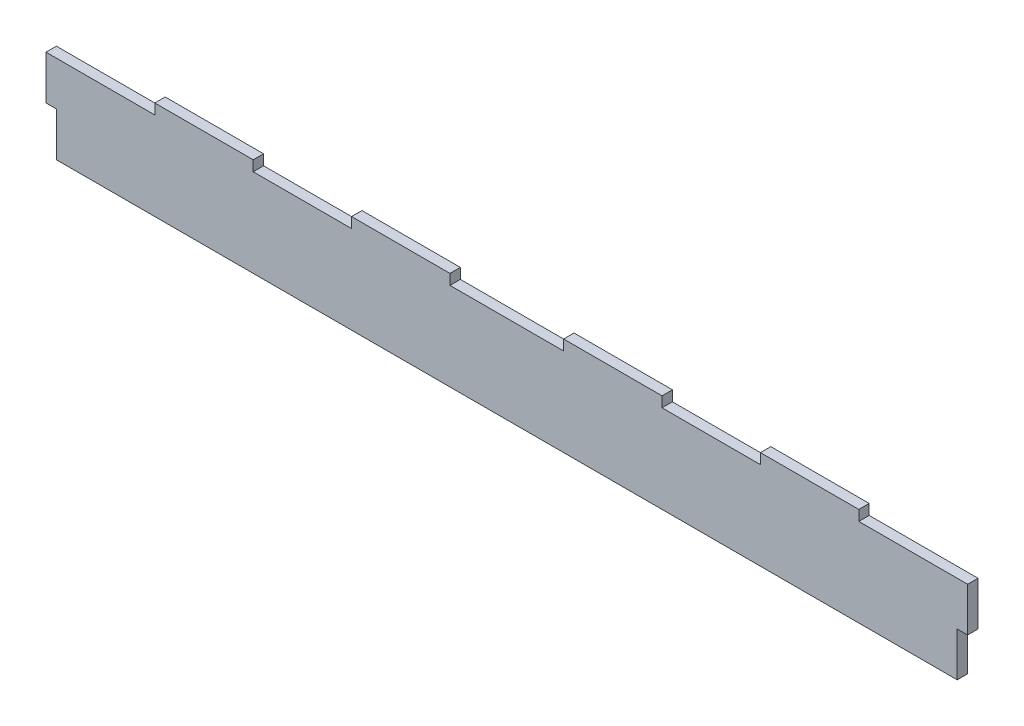
ISO-10303-21;
HEADER;
FILE_DESCRIPTION(('STEP AP214'),'2;1');
FILE_NAME('part.step','',(''),(''),'','','');
FILE_SCHEMA(('AUTOMOTIVE_DESIGN { 1 0 10303 214 1 1 1 1 }'));
ENDSEC;
DATA;
#1=APPLICATION_CONTEXT('core data for automotive mechanical design processes');
#2=APPLICATION_PROTOCOL_DEFINITION('international standard','automotive_design',2000,#1);
#3=PRODUCT_CONTEXT('',#1,'mechanical');
#4=PRODUCT('Part','Part','',(#3));
#5=PRODUCT_RELATED_PRODUCT_CATEGORY('part','',(#4));
#6=PRODUCT_DEFINITION_FORMATION('','',#4);
#7=PRODUCT_DEFINITION_CONTEXT('part definition',#1,'design');
#8=PRODUCT_DEFINITION('design','',#6,#7);
#9=PRODUCT_DEFINITION_SHAPE('','',#8);
#10=(LENGTH_UNIT() NAMED_UNIT(*) SI_UNIT(.MILLI.,.METRE.));
#11=(NAMED_UNIT(*) PLANE_ANGLE_UNIT() SI_UNIT($,.RADIAN.));
#12=(NAMED_UNIT(*) SI_UNIT($,.STERADIAN.) SOLID_ANGLE_UNIT());
#13=UNCERTAINTY_MEASURE_WITH_UNIT(LENGTH_MEASURE(1.E-05),#10,'distance_accuracy_value','');
#14=(GEOMETRIC_REPRESENTATION_CONTEXT(3) GLOBAL_UNCERTAINTY_ASSIGNED_CONTEXT((#13)) GLOBAL_UNIT_ASSIGNED_CONTEXT((#10,
#11,#12)) REPRESENTATION_CONTEXT('',''));
#15=CARTESIAN_POINT('',(0.,0.,0.));
#16=DIRECTION('',(0.,0.,1.));
#17=DIRECTION('',(1.,0.,0.));
#18=AXIS2_PLACEMENT_3D('',#15,#16,#17);
#19=CARTESIAN_POINT('',(3.00000000000001,12.7,3.));
#20=DIRECTION('',(1.,0.,0.));
#21=DIRECTION('',(0.,1.,0.));
#22=AXIS2_PLACEMENT_3D('',#19,#20,#21);
#23=PLANE('',#22);
#24=DIRECTION('',(0.,-1.,0.));
#25=VECTOR('',#24,1.);
#26=CARTESIAN_POINT('',(3.00000000000001,12.7,0.));
#27=LINE('',#26,#25);
#28=CARTESIAN_POINT('',(3.00000000000001,12.7,0.));
#29=VERTEX_POINT('',#28);
#30=CARTESIAN_POINT('',(3.00000000000002,0.,0.));
#31=VERTEX_POINT('',#30);
#32=EDGE_CURVE('E224',#29,#31,#27,.T.);
#33=ORIENTED_EDGE('',*,*,#32,.T.);
#34=DIRECTION('',(0.,0.,-1.));
#35=VECTOR('',#34,1.);
#36=CARTESIAN_POINT('',(3.00000000000002,0.,3.));
#37=LINE('',#36,#35);
#38=CARTESIAN_POINT('',(3.00000000000002,0.,3.));
#39=VERTEX_POINT('',#38);
#40=EDGE_CURVE('E11',#39,#31,#37,.T.);
#41=ORIENTED_EDGE('',*,*,#40,.F.);
#42=DIRECTION('',(0.,-1.,0.));
#43=VECTOR('',#42,1.);
#44=CARTESIAN_POINT('',(3.00000000000001,12.7,3.));
#45=LINE('',#44,#43);
#46=CARTESIAN_POINT('',(3.00000000000001,12.7,3.));
#47=VERTEX_POINT('',#46);
#48=EDGE_CURVE('E272',#47,#39,#45,.T.);
#49=ORIENTED_EDGE('',*,*,#48,.F.);
#50=DIRECTION('',(0.,0.,-1.));
#51=VECTOR('',#50,1.);
#52=CARTESIAN_POINT('',(3.00000000000001,12.7,3.));
#53=LINE('',#52,#51);
#54=EDGE_CURVE('E220',#47,#29,#53,.T.);
#55=ORIENTED_EDGE('',*,*,#54,.T.);
#56=EDGE_LOOP('',(#33,#41,#49,#55));
#57=FACE_BOUND('',#56,.T.);
#58=ADVANCED_FACE('F33',(#57),#23,.F.);
#59=CARTESIAN_POINT('',(3.00000000000002,0.,3.));
#60=DIRECTION('',(0.,1.,0.));
#61=DIRECTION('',(0.,0.,1.));
#62=AXIS2_PLACEMENT_3D('',#59,#60,#61);
#63=PLANE('',#62);
#64=DIRECTION('',(1.,0.,0.));
#65=VECTOR('',#64,1.);
#66=CARTESIAN_POINT('',(3.00000000000002,0.,0.));
#67=LINE('',#66,#65);
#68=CARTESIAN_POINT('',(263.,0.,0.));
#69=VERTEX_POINT('',#68);
#70=EDGE_CURVE('E227',#31,#69,#67,.T.);
#71=ORIENTED_EDGE('',*,*,#70,.T.);
#72=DIRECTION('',(0.,0.,-1.));
#73=VECTOR('',#72,1.);
#74=CARTESIAN_POINT('',(263.,0.,3.));
#75=LINE('',#74,#73);
#76=CARTESIAN_POINT('',(263.,0.,3.));
#77=VERTEX_POINT('',#76);
#78=EDGE_CURVE('E41',#77,#69,#75,.T.);
#79=ORIENTED_EDGE('',*,*,#78,.F.);
#80=DIRECTION('',(1.,0.,0.));
#81=VECTOR('',#80,1.);
#82=CARTESIAN_POINT('',(3.00000000000002,0.,3.));
#83=LINE('',#82,#81);
#84=EDGE_CURVE('E140',#39,#77,#83,.T.);
#85=ORIENTED_EDGE('',*,*,#84,.F.);
#86=ORIENTED_EDGE('',*,*,#40,.T.);
#87=EDGE_LOOP('',(#71,#79,#85,#86));
#88=FACE_BOUND('',#87,.T.);
#89=ADVANCED_FACE('F410',(#88),#63,.F.);
#90=CARTESIAN_POINT('',(263.,12.7,3.));
#91=DIRECTION('',(-1.,0.,0.));
#92=DIRECTION('',(0.,0.,1.));
#93=AXIS2_PLACEMENT_3D('',#90,#91,#92);
#94=PLANE('',#93);
#95=DIRECTION('',(0.,1.,0.));
#96=VECTOR('',#95,1.);
#97=CARTESIAN_POINT('',(263.,12.7,0.));
#98=LINE('',#97,#96);
#99=CARTESIAN_POINT('',(263.,12.7,0.));
#100=VERTEX_POINT('',#99);
#101=EDGE_CURVE('E229',#69,#100,#98,.T.);
#102=ORIENTED_EDGE('',*,*,#101,.T.);
#103=DIRECTION('',(0.,0.,-1.));
#104=VECTOR('',#103,1.);
#105=CARTESIAN_POINT('',(263.,12.7,3.));
#106=LINE('',#105,#104);
#107=CARTESIAN_POINT('',(263.,12.7,3.));
#108=VERTEX_POINT('',#107);
#109=EDGE_CURVE('E327',#108,#100,#106,.T.);
#110=ORIENTED_EDGE('',*,*,#109,.F.);
#111=DIRECTION('',(0.,1.,0.));
#112=VECTOR('',#111,1.);
#113=CARTESIAN_POINT('',(263.,12.7,3.));
#114=LINE('',#113,#112);
#115=EDGE_CURVE('E335',#77,#108,#114,.T.);
#116=ORIENTED_EDGE('',*,*,#115,.F.);
#117=ORIENTED_EDGE('',*,*,#78,.T.);
#118=EDGE_LOOP('',(#102,#110,#116,#117));
#119=FACE_BOUND('',#118,.T.);
#120=ADVANCED_FACE('F333',(#119),#94,.F.);
#121=CARTESIAN_POINT('',(266.,12.7000000000002,3.));
#122=DIRECTION('',(0.,1.,0.));
#123=DIRECTION('',(-1.,0.,0.));
#124=AXIS2_PLACEMENT_3D('',#121,#122,#123);
#125=PLANE('',#124);
#126=DIRECTION('',(1.,0.,0.));
#127=VECTOR('',#126,1.);
#128=CARTESIAN_POINT('',(266.,12.7000000000002,0.));
#129=LINE('',#128,#127);
#130=CARTESIAN_POINT('',(266.,12.7000000000002,0.));
#131=VERTEX_POINT('',#130);
#132=EDGE_CURVE('E231',#100,#131,#129,.T.);
#133=ORIENTED_EDGE('',*,*,#132,.T.);
#134=DIRECTION('',(0.,0.,-1.));
#135=VECTOR('',#134,1.);
#136=CARTESIAN_POINT('',(266.,12.7000000000002,3.));
#137=LINE('',#136,#135);
#138=CARTESIAN_POINT('',(266.,12.7000000000002,3.));
#139=VERTEX_POINT('',#138);
#140=EDGE_CURVE('E324',#139,#131,#137,.T.);
#141=ORIENTED_EDGE('',*,*,#140,.F.);
#142=DIRECTION('',(1.,0.,0.));
#143=VECTOR('',#142,1.);
#144=CARTESIAN_POINT('',(266.,12.7000000000002,3.));
#145=LINE('',#144,#143);
#146=EDGE_CURVE('E352',#108,#139,#145,.T.);
#147=ORIENTED_EDGE('',*,*,#146,.F.);
#148=ORIENTED_EDGE('',*,*,#109,.T.);
#149=EDGE_LOOP('',(#133,#141,#147,#148));
#150=FACE_BOUND('',#149,.T.);
#151=ADVANCED_FACE('F343',(#150),#125,.F.);
#152=CARTESIAN_POINT('',(266.,25.4,3.));
#153=DIRECTION('',(-1.,0.,0.));
#154=DIRECTION('',(0.,0.,1.));
#155=AXIS2_PLACEMENT_3D('',#152,#153,#154);
#156=PLANE('',#155);
#157=DIRECTION('',(0.,1.,0.));
#158=VECTOR('',#157,1.);
#159=CARTESIAN_POINT('',(266.,25.4,0.));
#160=LINE('',#159,#158);
#161=CARTESIAN_POINT('',(266.,25.4,0.));
#162=VERTEX_POINT('',#161);
#163=EDGE_CURVE('E233',#131,#162,#160,.T.);
#164=ORIENTED_EDGE('',*,*,#163,.T.);
#165=DIRECTION('',(0.,0.,-1.));
#166=VECTOR('',#165,1.);
#167=CARTESIAN_POINT('',(266.,25.4,3.));
#168=LINE('',#167,#166);
#169=CARTESIAN_POINT('',(266.,25.4,3.));
#170=VERTEX_POINT('',#169);
#171=EDGE_CURVE('E321',#170,#162,#168,.T.);
#172=ORIENTED_EDGE('',*,*,#171,.F.);
#173=DIRECTION('',(0.,1.,0.));
#174=VECTOR('',#173,1.);
#175=CARTESIAN_POINT('',(266.,25.4,3.));
#176=LINE('',#175,#174);
#177=EDGE_CURVE('E349',#139,#170,#176,.T.);
#178=ORIENTED_EDGE('',*,*,#177,.F.);
#179=ORIENTED_EDGE('',*,*,#140,.T.);
#180=EDGE_LOOP('',(#164,#172,#178,#179));
#181=FACE_BOUND('',#180,.T.);
#182=ADVANCED_FACE('F347',(#181),#156,.F.);
#183=CARTESIAN_POINT('',(263.,25.4,3.));
#184=DIRECTION('',(0.,-1.,0.));
#185=DIRECTION('',(0.,0.,-1.));
#186=AXIS2_PLACEMENT_3D('',#183,#184,#185);
#187=PLANE('',#186);
#188=DIRECTION('',(-1.,0.,0.));
#189=VECTOR('',#188,1.);
#190=CARTESIAN_POINT('',(263.,25.4,0.));
#191=LINE('',#190,#189);
#192=CARTESIAN_POINT('',(234.6,25.4,0.));
#193=VERTEX_POINT('',#192);
#194=EDGE_CURVE('E236',#162,#193,#191,.T.);
#195=ORIENTED_EDGE('',*,*,#194,.T.);
#196=DIRECTION('',(0.,0.,-1.));
#197=VECTOR('',#196,1.);
#198=CARTESIAN_POINT('',(234.6,25.4,3.));
#199=LINE('',#198,#197);
#200=CARTESIAN_POINT('',(234.6,25.4,3.));
#201=VERTEX_POINT('',#200);
#202=EDGE_CURVE('E318',#201,#193,#199,.T.);
#203=ORIENTED_EDGE('',*,*,#202,.F.);
#204=DIRECTION('',(-1.,0.,0.));
#205=VECTOR('',#204,1.);
#206=CARTESIAN_POINT('',(266.,25.4,3.));
#207=LINE('',#206,#205);
#208=EDGE_CURVE('E351',#170,#201,#207,.T.);
#209=ORIENTED_EDGE('',*,*,#208,.F.);
#210=ORIENTED_EDGE('',*,*,#171,.T.);
#211=EDGE_LOOP('',(#195,#203,#209,#210));
#212=FACE_BOUND('',#211,.T.);
#213=ADVANCED_FACE('F423',(#212),#187,.F.);
#214=CARTESIAN_POINT('',(234.6,25.4,3.));
#215=DIRECTION('',(-1.,0.,0.));
#216=DIRECTION('',(0.,0.,1.));
#217=AXIS2_PLACEMENT_3D('',#214,#215,#216);
#218=PLANE('',#217);
#219=DIRECTION('',(0.,1.,0.));
#220=VECTOR('',#219,1.);
#221=CARTESIAN_POINT('',(234.6,25.4,0.));
#222=LINE('',#221,#220);
#223=CARTESIAN_POINT('',(234.6,28.4,0.));
#224=VERTEX_POINT('',#223);
#225=EDGE_CURVE('E238',#193,#224,#222,.T.);
#226=ORIENTED_EDGE('',*,*,#225,.T.);
#227=DIRECTION('',(0.,0.,-1.));
#228=VECTOR('',#227,1.);
#229=CARTESIAN_POINT('',(234.6,28.4,3.));
#230=LINE('',#229,#228);
#231=CARTESIAN_POINT('',(234.6,28.4,3.));
#232=VERTEX_POINT('',#231);
#233=EDGE_CURVE('E315',#232,#224,#230,.T.);
#234=ORIENTED_EDGE('',*,*,#233,.F.);
#235=DIRECTION('',(0.,1.,0.));
#236=VECTOR('',#235,1.);
#237=CARTESIAN_POINT('',(234.6,25.4,3.));
#238=LINE('',#237,#236);
#239=EDGE_CURVE('E354',#201,#232,#238,.T.);
#240=ORIENTED_EDGE('',*,*,#239,.F.);
#241=ORIENTED_EDGE('',*,*,#202,.T.);
#242=EDGE_LOOP('',(#226,#234,#240,#241));
#243=FACE_BOUND('',#242,.T.);
#244=ADVANCED_FACE('F426',(#243),#218,.F.);
#245=CARTESIAN_POINT('',(234.6,28.4,3.));
#246=DIRECTION('',(0.,-1.,0.));
#247=DIRECTION('',(0.,0.,-1.));
#248=AXIS2_PLACEMENT_3D('',#245,#246,#247);
#249=PLANE('',#248);
#250=DIRECTION('',(-1.,0.,0.));
#251=VECTOR('',#250,1.);
#252=CARTESIAN_POINT('',(234.6,28.4,0.));
#253=LINE('',#252,#251);
#254=CARTESIAN_POINT('',(206.2,28.4,0.));
#255=VERTEX_POINT('',#254);
#256=EDGE_CURVE('E240',#224,#255,#253,.T.);
#257=ORIENTED_EDGE('',*,*,#256,.T.);
#258=DIRECTION('',(0.,0.,-1.));
#259=VECTOR('',#258,1.);
#260=CARTESIAN_POINT('',(206.2,28.4,3.));
#261=LINE('',#260,#259);
#262=CARTESIAN_POINT('',(206.2,28.4,3.));
#263=VERTEX_POINT('',#262);
#264=EDGE_CURVE('E312',#263,#255,#261,.T.);
#265=ORIENTED_EDGE('',*,*,#264,.F.);
#266=DIRECTION('',(-1.,0.,0.));
#267=VECTOR('',#266,1.);
#268=CARTESIAN_POINT('',(234.6,28.4,3.));
#269=LINE('',#268,#267);
#270=EDGE_CURVE('E360',#232,#263,#269,.T.);
#271=ORIENTED_EDGE('',*,*,#270,.F.);
#272=ORIENTED_EDGE('',*,*,#233,.T.);
#273=EDGE_LOOP('',(#257,#265,#271,#272));
#274=FACE_BOUND('',#273,.T.);
#275=ADVANCED_FACE('F430',(#274),#249,.F.);
#276=CARTESIAN_POINT('',(206.2,28.4,3.));
#277=DIRECTION('',(1.,0.,0.));
#278=DIRECTION('',(0.,1.,0.));
#279=AXIS2_PLACEMENT_3D('',#276,#277,#278);
#280=PLANE('',#279);
#281=DIRECTION('',(0.,-1.,0.));
#282=VECTOR('',#281,1.);
#283=CARTESIAN_POINT('',(206.2,28.4,0.));
#284=LINE('',#283,#282);
#285=CARTESIAN_POINT('',(206.2,25.4,0.));
#286=VERTEX_POINT('',#285);
#287=EDGE_CURVE('E242',#255,#286,#284,.T.);
#288=ORIENTED_EDGE('',*,*,#287,.T.);
#289=DIRECTION('',(0.,0.,-1.));
#290=VECTOR('',#289,1.);
#291=CARTESIAN_POINT('',(206.2,25.4,3.));
#292=LINE('',#291,#290);
#293=CARTESIAN_POINT('',(206.2,25.4,3.));
#294=VERTEX_POINT('',#293);
#295=EDGE_CURVE('E309',#294,#286,#292,.T.);
#296=ORIENTED_EDGE('',*,*,#295,.F.);
#297=DIRECTION('',(0.,-1.,0.));
#298=VECTOR('',#297,1.);
#299=CARTESIAN_POINT('',(206.2,28.4,3.));
#300=LINE('',#299,#298);
#301=EDGE_CURVE('E362',#263,#294,#300,.T.);
#302=ORIENTED_EDGE('',*,*,#301,.F.);
#303=ORIENTED_EDGE('',*,*,#264,.T.);
#304=EDGE_LOOP('',(#288,#296,#302,#303));
#305=FACE_BOUND('',#304,.T.);
#306=ADVANCED_FACE('F434',(#305),#280,.F.);
#307=CARTESIAN_POINT('',(206.2,25.4,3.));
#308=DIRECTION('',(0.,-1.,0.));
#309=DIRECTION('',(0.,0.,-1.));
#310=AXIS2_PLACEMENT_3D('',#307,#308,#309);
#311=PLANE('',#310);
#312=DIRECTION('',(-1.,0.,0.));
#313=VECTOR('',#312,1.);
#314=CARTESIAN_POINT('',(206.2,25.4,0.));
#315=LINE('',#314,#313);
#316=CARTESIAN_POINT('',(177.8,25.4,0.));
#317=VERTEX_POINT('',#316);
#318=EDGE_CURVE('E244',#286,#317,#315,.T.);
#319=ORIENTED_EDGE('',*,*,#318,.T.);
#320=DIRECTION('',(0.,0.,-1.));
#321=VECTOR('',#320,1.);
#322=CARTESIAN_POINT('',(177.8,25.4,3.));
#323=LINE('',#322,#321);
#324=CARTESIAN_POINT('',(177.8,25.4,3.));
#325=VERTEX_POINT('',#324);
#326=EDGE_CURVE('E306',#325,#317,#323,.T.);
#327=ORIENTED_EDGE('',*,*,#326,.F.);
#328=DIRECTION('',(-1.,0.,0.));
#329=VECTOR('',#328,1.);
#330=CARTESIAN_POINT('',(206.2,25.4,3.));
#331=LINE('',#330,#329);
#332=EDGE_CURVE('E364',#294,#325,#331,.T.);
#333=ORIENTED_EDGE('',*,*,#332,.F.);
#334=ORIENTED_EDGE('',*,*,#295,.T.);
#335=EDGE_LOOP('',(#319,#327,#333,#334));
#336=FACE_BOUND('',#335,.T.);
#337=ADVANCED_FACE('F438',(#336),#311,.F.);
#338=CARTESIAN_POINT('',(177.8,25.4,3.));
#339=DIRECTION('',(-1.,0.,0.));
#340=DIRECTION('',(0.,0.,1.));
#341=AXIS2_PLACEMENT_3D('',#338,#339,#340);
#342=PLANE('',#341);
#343=DIRECTION('',(0.,1.,0.));
#344=VECTOR('',#343,1.);
#345=CARTESIAN_POINT('',(177.8,25.4,0.));
#346=LINE('',#345,#344);
#347=CARTESIAN_POINT('',(177.8,28.4,0.));
#348=VERTEX_POINT('',#347);
#349=EDGE_CURVE('E246',#317,#348,#346,.T.);
#350=ORIENTED_EDGE('',*,*,#349,.T.);
#351=DIRECTION('',(0.,0.,-1.));
#352=VECTOR('',#351,1.);
#353=CARTESIAN_POINT('',(177.8,28.4,3.));
#354=LINE('',#353,#352);
#355=CARTESIAN_POINT('',(177.8,28.4,3.));
#356=VERTEX_POINT('',#355);
#357=EDGE_CURVE('E303',#356,#348,#354,.T.);
#358=ORIENTED_EDGE('',*,*,#357,.F.);
#359=DIRECTION('',(0.,1.,0.));
#360=VECTOR('',#359,1.);
#361=CARTESIAN_POINT('',(177.8,25.4,3.));
#362=LINE('',#361,#360);
#363=EDGE_CURVE('E366',#325,#356,#362,.T.);
#364=ORIENTED_EDGE('',*,*,#363,.F.);
#365=ORIENTED_EDGE('',*,*,#326,.T.);
#366=EDGE_LOOP('',(#350,#358,#364,#365));
#367=FACE_BOUND('',#366,.T.);
#368=ADVANCED_FACE('F442',(#367),#342,.F.);
#369=CARTESIAN_POINT('',(177.8,28.4,3.));
#370=DIRECTION('',(0.,-1.,0.));
#371=DIRECTION('',(0.,0.,-1.));
#372=AXIS2_PLACEMENT_3D('',#369,#370,#371);
#373=PLANE('',#372);
#374=DIRECTION('',(-1.,0.,0.));
#375=VECTOR('',#374,1.);
#376=CARTESIAN_POINT('',(177.8,28.4,0.));
#377=LINE('',#376,#375);
#378=CARTESIAN_POINT('',(149.4,28.4,0.));
#379=VERTEX_POINT('',#378);
#380=EDGE_CURVE('E248',#348,#379,#377,.T.);
#381=ORIENTED_EDGE('',*,*,#380,.T.);
#382=DIRECTION('',(0.,0.,-1.));
#383=VECTOR('',#382,1.);
#384=CARTESIAN_POINT('',(149.4,28.4,3.));
#385=LINE('',#384,#383);
#386=CARTESIAN_POINT('',(149.4,28.4,3.));
#387=VERTEX_POINT('',#386);
#388=EDGE_CURVE('E300',#387,#379,#385,.T.);
#389=ORIENTED_EDGE('',*,*,#388,.F.);
#390=DIRECTION('',(-1.,0.,0.));
#391=VECTOR('',#390,1.);
#392=CARTESIAN_POINT('',(177.8,28.4,3.));
#393=LINE('',#392,#391);
#394=EDGE_CURVE('E368',#356,#387,#393,.T.);
#395=ORIENTED_EDGE('',*,*,#394,.F.);
#396=ORIENTED_EDGE('',*,*,#357,.T.);
#397=EDGE_LOOP('',(#381,#389,#395,#396));
#398=FACE_BOUND('',#397,.T.);
#399=ADVANCED_FACE('F446',(#398),#373,.F.);
#400=CARTESIAN_POINT('',(149.4,28.4,3.));
#401=DIRECTION('',(1.,0.,0.));
#402=DIRECTION('',(0.,0.,-1.));
#403=AXIS2_PLACEMENT_3D('',#400,#401,#402);
#404=PLANE('',#403);
#405=DIRECTION('',(0.,-1.,0.));
#406=VECTOR('',#405,1.);
#407=CARTESIAN_POINT('',(149.4,28.4,0.));
#408=LINE('',#407,#406);
#409=CARTESIAN_POINT('',(149.4,25.4,0.));
#410=VERTEX_POINT('',#409);
#411=EDGE_CURVE('E250',#379,#410,#408,.T.);
#412=ORIENTED_EDGE('',*,*,#411,.T.);
#413=DIRECTION('',(0.,0.,-1.));
#414=VECTOR('',#413,1.);
#415=CARTESIAN_POINT('',(149.4,25.4,3.));
#416=LINE('',#415,#414);
#417=CARTESIAN_POINT('',(149.4,25.4,3.));
#418=VERTEX_POINT('',#417);
#419=EDGE_CURVE('E297',#418,#410,#416,.T.);
#420=ORIENTED_EDGE('',*,*,#419,.F.);
#421=DIRECTION('',(0.,-1.,0.));
#422=VECTOR('',#421,1.);
#423=CARTESIAN_POINT('',(149.4,28.4,3.));
#424=LINE('',#423,#422);
#425=EDGE_CURVE('E370',#387,#418,#424,.T.);
#426=ORIENTED_EDGE('',*,*,#425,.F.);
#427=ORIENTED_EDGE('',*,*,#388,.T.);
#428=EDGE_LOOP('',(#412,#420,#426,#427));
#429=FACE_BOUND('',#428,.T.);
#430=ADVANCED_FACE('F450',(#429),#404,.F.);
#431=CARTESIAN_POINT('',(116.6,25.4,3.));
#432=DIRECTION('',(0.,-1.,0.));
#433=DIRECTION('',(0.,0.,-1.));
#434=AXIS2_PLACEMENT_3D('',#431,#432,#433);
#435=PLANE('',#434);
#436=DIRECTION('',(-1.,0.,0.));
#437=VECTOR('',#436,1.);
#438=CARTESIAN_POINT('',(116.6,25.4,0.));
#439=LINE('',#438,#437);
#440=CARTESIAN_POINT('',(116.6,25.4,0.));
#441=VERTEX_POINT('',#440);
#442=EDGE_CURVE('E252',#410,#441,#439,.T.);
#443=ORIENTED_EDGE('',*,*,#442,.T.);
#444=DIRECTION('',(0.,0.,-1.));
#445=VECTOR('',#444,1.);
#446=CARTESIAN_POINT('',(116.6,25.4,3.));
#447=LINE('',#446,#445);
#448=CARTESIAN_POINT('',(116.6,25.4,3.));
#449=VERTEX_POINT('',#448);
#450=EDGE_CURVE('E294',#449,#441,#447,.T.);
#451=ORIENTED_EDGE('',*,*,#450,.F.);
#452=DIRECTION('',(-1.,0.,0.));
#453=VECTOR('',#452,1.);
#454=CARTESIAN_POINT('',(116.6,25.4,3.));
#455=LINE('',#454,#453);
#456=EDGE_CURVE('E372',#418,#449,#455,.T.);
#457=ORIENTED_EDGE('',*,*,#456,.F.);
#458=ORIENTED_EDGE('',*,*,#419,.T.);
#459=EDGE_LOOP('',(#443,#451,#457,#458));
#460=FACE_BOUND('',#459,.T.);
#461=ADVANCED_FACE('F454',(#460),#435,.F.);
#462=CARTESIAN_POINT('',(116.6,28.4,3.));
#463=DIRECTION('',(-1.,0.,0.));
#464=DIRECTION('',(0.,0.,1.));
#465=AXIS2_PLACEMENT_3D('',#462,#463,#464);
#466=PLANE('',#465);
#467=DIRECTION('',(0.,1.,0.));
#468=VECTOR('',#467,1.);
#469=CARTESIAN_POINT('',(116.6,28.4,0.));
#470=LINE('',#469,#468);
#471=CARTESIAN_POINT('',(116.6,28.4,0.));
#472=VERTEX_POINT('',#471);
#473=EDGE_CURVE('E254',#441,#472,#470,.T.);
#474=ORIENTED_EDGE('',*,*,#473,.T.);
#475=DIRECTION('',(0.,0.,-1.));
#476=VECTOR('',#475,1.);
#477=CARTESIAN_POINT('',(116.6,28.4,3.));
#478=LINE('',#477,#476);
#479=CARTESIAN_POINT('',(116.6,28.4,3.));
#480=VERTEX_POINT('',#479);
#481=EDGE_CURVE('E291',#480,#472,#478,.T.);
#482=ORIENTED_EDGE('',*,*,#481,.F.);
#483=DIRECTION('',(0.,1.,0.));
#484=VECTOR('',#483,1.);
#485=CARTESIAN_POINT('',(116.6,28.4,3.));
#486=LINE('',#485,#484);
#487=EDGE_CURVE('E374',#449,#480,#486,.T.);
#488=ORIENTED_EDGE('',*,*,#487,.F.);
#489=ORIENTED_EDGE('',*,*,#450,.T.);
#490=EDGE_LOOP('',(#474,#482,#488,#489));
#491=FACE_BOUND('',#490,.T.);
#492=ADVANCED_FACE('F458',(#491),#466,.F.);
#493=CARTESIAN_POINT('',(88.2,28.4,3.));
#494=DIRECTION('',(0.,-1.,0.));
#495=DIRECTION('',(0.,0.,-1.));
#496=AXIS2_PLACEMENT_3D('',#493,#494,#495);
#497=PLANE('',#496);
#498=DIRECTION('',(-1.,0.,0.));
#499=VECTOR('',#498,1.);
#500=CARTESIAN_POINT('',(88.2,28.4,0.));
#501=LINE('',#500,#499);
#502=CARTESIAN_POINT('',(88.2,28.4,0.));
#503=VERTEX_POINT('',#502);
#504=EDGE_CURVE('E256',#472,#503,#501,.T.);
#505=ORIENTED_EDGE('',*,*,#504,.T.);
#506=DIRECTION('',(0.,0.,-1.));
#507=VECTOR('',#506,1.);
#508=CARTESIAN_POINT('',(88.2,28.4,3.));
#509=LINE('',#508,#507);
#510=CARTESIAN_POINT('',(88.2,28.4,3.));
#511=VERTEX_POINT('',#510);
#512=EDGE_CURVE('E288',#511,#503,#509,.T.);
#513=ORIENTED_EDGE('',*,*,#512,.F.);
#514=DIRECTION('',(-1.,0.,0.));
#515=VECTOR('',#514,1.);
#516=CARTESIAN_POINT('',(88.2,28.4,3.));
#517=LINE('',#516,#515);
#518=EDGE_CURVE('E376',#480,#511,#517,.T.);
#519=ORIENTED_EDGE('',*,*,#518,.F.);
#520=ORIENTED_EDGE('',*,*,#481,.T.);
#521=EDGE_LOOP('',(#505,#513,#519,#520));
#522=FACE_BOUND('',#521,.T.);
#523=ADVANCED_FACE('F462',(#522),#497,.F.);
#524=CARTESIAN_POINT('',(88.2,25.4,3.));
#525=DIRECTION('',(1.,0.,0.));
#526=DIRECTION('',(0.,0.,-1.));
#527=AXIS2_PLACEMENT_3D('',#524,#525,#526);
#528=PLANE('',#527);
#529=DIRECTION('',(0.,-1.,0.));
#530=VECTOR('',#529,1.);
#531=CARTESIAN_POINT('',(88.2,25.4,0.));
#532=LINE('',#531,#530);
#533=CARTESIAN_POINT('',(88.2,25.4,0.));
#534=VERTEX_POINT('',#533);
#535=EDGE_CURVE('E258',#503,#534,#532,.T.);
#536=ORIENTED_EDGE('',*,*,#535,.T.);
#537=DIRECTION('',(0.,0.,-1.));
#538=VECTOR('',#537,1.);
#539=CARTESIAN_POINT('',(88.2,25.4,3.));
#540=LINE('',#539,#538);
#541=CARTESIAN_POINT('',(88.2,25.4,3.));
#542=VERTEX_POINT('',#541);
#543=EDGE_CURVE('E285',#542,#534,#540,.T.);
#544=ORIENTED_EDGE('',*,*,#543,.F.);
#545=DIRECTION('',(0.,-1.,0.));
#546=VECTOR('',#545,1.);
#547=CARTESIAN_POINT('',(88.2,25.4,3.));
#548=LINE('',#547,#546);
#549=EDGE_CURVE('E378',#511,#542,#548,.T.);
#550=ORIENTED_EDGE('',*,*,#549,.F.);
#551=ORIENTED_EDGE('',*,*,#512,.T.);
#552=EDGE_LOOP('',(#536,#544,#550,#551));
#553=FACE_BOUND('',#552,.T.);
#554=ADVANCED_FACE('F466',(#553),#528,.F.);
#555=CARTESIAN_POINT('',(59.8,25.4,3.));
#556=DIRECTION('',(0.,-1.,0.));
#557=DIRECTION('',(0.,0.,-1.));
#558=AXIS2_PLACEMENT_3D('',#555,#556,#557);
#559=PLANE('',#558);
#560=DIRECTION('',(-1.,0.,0.));
#561=VECTOR('',#560,1.);
#562=CARTESIAN_POINT('',(59.8,25.4,0.));
#563=LINE('',#562,#561);
#564=CARTESIAN_POINT('',(59.8,25.4,0.));
#565=VERTEX_POINT('',#564);
#566=EDGE_CURVE('E260',#534,#565,#563,.T.);
#567=ORIENTED_EDGE('',*,*,#566,.T.);
#568=DIRECTION('',(0.,0.,-1.));
#569=VECTOR('',#568,1.);
#570=CARTESIAN_POINT('',(59.8,25.4,3.));
#571=LINE('',#570,#569);
#572=CARTESIAN_POINT('',(59.8,25.4,3.));
#573=VERTEX_POINT('',#572);
#574=EDGE_CURVE('E282',#573,#565,#571,.T.);
#575=ORIENTED_EDGE('',*,*,#574,.F.);
#576=DIRECTION('',(-1.,0.,0.));
#577=VECTOR('',#576,1.);
#578=CARTESIAN_POINT('',(59.8,25.4,3.));
#579=LINE('',#578,#577);
#580=EDGE_CURVE('E380',#542,#573,#579,.T.);
#581=ORIENTED_EDGE('',*,*,#580,.F.);
#582=ORIENTED_EDGE('',*,*,#543,.T.);
#583=EDGE_LOOP('',(#567,#575,#581,#582));
#584=FACE_BOUND('',#583,.T.);
#585=ADVANCED_FACE('F470',(#584),#559,.F.);
#586=CARTESIAN_POINT('',(59.8,28.4,3.));
#587=DIRECTION('',(-1.,0.,0.));
#588=DIRECTION('',(0.,-1.,0.));
#589=AXIS2_PLACEMENT_3D('',#586,#587,#588);
#590=PLANE('',#589);
#591=DIRECTION('',(0.,1.,0.));
#592=VECTOR('',#591,1.);
#593=CARTESIAN_POINT('',(59.8,28.4,0.));
#594=LINE('',#593,#592);
#595=CARTESIAN_POINT('',(59.8,28.4,0.));
#596=VERTEX_POINT('',#595);
#597=EDGE_CURVE('E262',#565,#596,#594,.T.);
#598=ORIENTED_EDGE('',*,*,#597,.T.);
#599=DIRECTION('',(0.,0.,-1.));
#600=VECTOR('',#599,1.);
#601=CARTESIAN_POINT('',(59.8,28.4,3.));
#602=LINE('',#601,#600);
#603=CARTESIAN_POINT('',(59.8,28.4,3.));
#604=VERTEX_POINT('',#603);
#605=EDGE_CURVE('E279',#604,#596,#602,.T.);
#606=ORIENTED_EDGE('',*,*,#605,.F.);
#607=DIRECTION('',(0.,1.,0.));
#608=VECTOR('',#607,1.);
#609=CARTESIAN_POINT('',(59.8,28.4,3.));
#610=LINE('',#609,#608);
#611=EDGE_CURVE('E382',#573,#604,#610,.T.);
#612=ORIENTED_EDGE('',*,*,#611,.F.);
#613=ORIENTED_EDGE('',*,*,#574,.T.);
#614=EDGE_LOOP('',(#598,#606,#612,#613));
#615=FACE_BOUND('',#614,.T.);
#616=ADVANCED_FACE('F474',(#615),#590,.F.);
#617=CARTESIAN_POINT('',(31.4,28.4,3.));
#618=DIRECTION('',(0.,-1.,0.));
#619=DIRECTION('',(0.,0.,-1.));
#620=AXIS2_PLACEMENT_3D('',#617,#618,#619);
#621=PLANE('',#620);
#622=DIRECTION('',(-1.,0.,0.));
#623=VECTOR('',#622,1.);
#624=CARTESIAN_POINT('',(31.4,28.4,0.));
#625=LINE('',#624,#623);
#626=CARTESIAN_POINT('',(31.4,28.4,0.));
#627=VERTEX_POINT('',#626);
#628=EDGE_CURVE('E264',#596,#627,#625,.T.);
#629=ORIENTED_EDGE('',*,*,#628,.T.);
#630=DIRECTION('',(0.,0.,-1.));
#631=VECTOR('',#630,1.);
#632=CARTESIAN_POINT('',(31.4,28.4,3.));
#633=LINE('',#632,#631);
#634=CARTESIAN_POINT('',(31.4,28.4,3.));
#635=VERTEX_POINT('',#634);
#636=EDGE_CURVE('E276',#635,#627,#633,.T.);
#637=ORIENTED_EDGE('',*,*,#636,.F.);
#638=DIRECTION('',(-1.,0.,0.));
#639=VECTOR('',#638,1.);
#640=CARTESIAN_POINT('',(31.4,28.4,3.));
#641=LINE('',#640,#639);
#642=EDGE_CURVE('E384',#604,#635,#641,.T.);
#643=ORIENTED_EDGE('',*,*,#642,.F.);
#644=ORIENTED_EDGE('',*,*,#605,.T.);
#645=EDGE_LOOP('',(#629,#637,#643,#644));
#646=FACE_BOUND('',#645,.T.);
#647=ADVANCED_FACE('F390',(#646),#621,.F.);
#648=CARTESIAN_POINT('',(31.4,25.4,3.));
#649=DIRECTION('',(1.,0.,0.));
#650=DIRECTION('',(0.,0.,-1.));
#651=AXIS2_PLACEMENT_3D('',#648,#649,#650);
#652=PLANE('',#651);
#653=DIRECTION('',(0.,-1.,0.));
#654=VECTOR('',#653,1.);
#655=CARTESIAN_POINT('',(31.4,25.4,0.));
#656=LINE('',#655,#654);
#657=CARTESIAN_POINT('',(31.4,25.4,0.));
#658=VERTEX_POINT('',#657);
#659=EDGE_CURVE('E266',#627,#658,#656,.T.);
#660=ORIENTED_EDGE('',*,*,#659,.T.);
#661=DIRECTION('',(0.,0.,-1.));
#662=VECTOR('',#661,1.);
#663=CARTESIAN_POINT('',(31.4,25.4,3.));
#664=LINE('',#663,#662);
#665=CARTESIAN_POINT('',(31.4,25.4,3.));
#666=VERTEX_POINT('',#665);
#667=EDGE_CURVE('E215',#666,#658,#664,.T.);
#668=ORIENTED_EDGE('',*,*,#667,.F.);
#669=DIRECTION('',(0.,-1.,0.));
#670=VECTOR('',#669,1.);
#671=CARTESIAN_POINT('',(31.4,25.4,3.));
#672=LINE('',#671,#670);
#673=EDGE_CURVE('E207',#635,#666,#672,.T.);
#674=ORIENTED_EDGE('',*,*,#673,.F.);
#675=ORIENTED_EDGE('',*,*,#636,.T.);
#676=EDGE_LOOP('',(#660,#668,#674,#675));
#677=FACE_BOUND('',#676,.T.);
#678=ADVANCED_FACE('F394',(#677),#652,.F.);
#679=CARTESIAN_POINT('',(0.,25.4,3.));
#680=DIRECTION('',(0.,-1.,0.));
#681=DIRECTION('',(0.,0.,-1.));
#682=AXIS2_PLACEMENT_3D('',#679,#680,#681);
#683=PLANE('',#682);
#684=DIRECTION('',(-1.,0.,0.));
#685=VECTOR('',#684,1.);
#686=CARTESIAN_POINT('',(0.,25.4,0.));
#687=LINE('',#686,#685);
#688=CARTESIAN_POINT('',(0.,25.4,0.));
#689=VERTEX_POINT('',#688);
#690=EDGE_CURVE('E214',#658,#689,#687,.T.);
#691=ORIENTED_EDGE('',*,*,#690,.T.);
#692=DIRECTION('',(0.,0.,-1.));
#693=VECTOR('',#692,1.);
#694=CARTESIAN_POINT('',(0.,25.4,3.));
#695=LINE('',#694,#693);
#696=CARTESIAN_POINT('',(0.,25.4,3.));
#697=VERTEX_POINT('',#696);
#698=EDGE_CURVE('E212',#697,#689,#695,.T.);
#699=ORIENTED_EDGE('',*,*,#698,.F.);
#700=DIRECTION('',(-1.,0.,0.));
#701=VECTOR('',#700,1.);
#702=CARTESIAN_POINT('',(3.,25.4,3.));
#703=LINE('',#702,#701);
#704=EDGE_CURVE('E201',#666,#697,#703,.T.);
#705=ORIENTED_EDGE('',*,*,#704,.F.);
#706=ORIENTED_EDGE('',*,*,#667,.T.);
#707=EDGE_LOOP('',(#691,#699,#705,#706));
#708=FACE_BOUND('',#707,.T.);
#709=ADVANCED_FACE('F213',(#708),#683,.F.);
#710=CARTESIAN_POINT('',(0.,25.4,3.));
#711=DIRECTION('',(1.,0.,0.));
#712=DIRECTION('',(0.,1.,0.));
#713=AXIS2_PLACEMENT_3D('',#710,#711,#712);
#714=PLANE('',#713);
#715=DIRECTION('',(0.,-1.,0.));
#716=VECTOR('',#715,1.);
#717=CARTESIAN_POINT('',(0.,25.4,0.));
#718=LINE('',#717,#716);
#719=CARTESIAN_POINT('',(0.,12.7,0.));
#720=VERTEX_POINT('',#719);
#721=EDGE_CURVE('E126',#689,#720,#718,.T.);
#722=ORIENTED_EDGE('',*,*,#721,.T.);
#723=DIRECTION('',(0.,0.,-1.));
#724=VECTOR('',#723,1.);
#725=CARTESIAN_POINT('',(0.,12.7,3.));
#726=LINE('',#725,#724);
#727=CARTESIAN_POINT('',(0.,12.7,3.));
#728=VERTEX_POINT('',#727);
#729=EDGE_CURVE('E216',#728,#720,#726,.T.);
#730=ORIENTED_EDGE('',*,*,#729,.F.);
#731=DIRECTION('',(0.,-1.,0.));
#732=VECTOR('',#731,1.);
#733=CARTESIAN_POINT('',(0.,25.4,3.));
#734=LINE('',#733,#732);
#735=EDGE_CURVE('E205',#697,#728,#734,.T.);
#736=ORIENTED_EDGE('',*,*,#735,.F.);
#737=ORIENTED_EDGE('',*,*,#698,.T.);
#738=EDGE_LOOP('',(#722,#730,#736,#737));
#739=FACE_BOUND('',#738,.T.);
#740=ADVANCED_FACE('F218',(#739),#714,.F.);
#741=CARTESIAN_POINT('',(0.,12.7,3.));
#742=DIRECTION('',(0.,1.,0.));
#743=DIRECTION('',(0.,0.,1.));
#744=AXIS2_PLACEMENT_3D('',#741,#742,#743);
#745=PLANE('',#744);
#746=DIRECTION('',(1.,0.,0.));
#747=VECTOR('',#746,1.);
#748=CARTESIAN_POINT('',(0.,12.7,0.));
#749=LINE('',#748,#747);
#750=EDGE_CURVE('E132',#720,#29,#749,.T.);
#751=ORIENTED_EDGE('',*,*,#750,.T.);
#752=ORIENTED_EDGE('',*,*,#54,.F.);
#753=DIRECTION('',(1.,0.,0.));
#754=VECTOR('',#753,1.);
#755=CARTESIAN_POINT('',(0.,12.7,3.));
#756=LINE('',#755,#754);
#757=EDGE_CURVE('E49',#728,#47,#756,.T.);
#758=ORIENTED_EDGE('',*,*,#757,.F.);
#759=ORIENTED_EDGE('',*,*,#729,.T.);
#760=EDGE_LOOP('',(#751,#752,#758,#759));
#761=FACE_BOUND('',#760,.T.);
#762=ADVANCED_FACE('F399',(#761),#745,.F.);
#763=CARTESIAN_POINT('',(0.,0.,3.));
#764=DIRECTION('',(0.,0.,1.));
#765=DIRECTION('',(1.,0.,0.));
#766=AXIS2_PLACEMENT_3D('',#763,#764,#765);
#767=PLANE('',#766);
#768=ORIENTED_EDGE('',*,*,#48,.T.);
#769=ORIENTED_EDGE('',*,*,#84,.T.);
#770=ORIENTED_EDGE('',*,*,#115,.T.);
#771=ORIENTED_EDGE('',*,*,#146,.T.);
#772=ORIENTED_EDGE('',*,*,#177,.T.);
#773=ORIENTED_EDGE('',*,*,#208,.T.);
#774=ORIENTED_EDGE('',*,*,#239,.T.);
#775=ORIENTED_EDGE('',*,*,#270,.T.);
#776=ORIENTED_EDGE('',*,*,#301,.T.);
#777=ORIENTED_EDGE('',*,*,#332,.T.);
#778=ORIENTED_EDGE('',*,*,#363,.T.);
#779=ORIENTED_EDGE('',*,*,#394,.T.);
#780=ORIENTED_EDGE('',*,*,#425,.T.);
#781=ORIENTED_EDGE('',*,*,#456,.T.);
#782=ORIENTED_EDGE('',*,*,#487,.T.);
#783=ORIENTED_EDGE('',*,*,#518,.T.);
#784=ORIENTED_EDGE('',*,*,#549,.T.);
#785=ORIENTED_EDGE('',*,*,#580,.T.);
#786=ORIENTED_EDGE('',*,*,#611,.T.);
#787=ORIENTED_EDGE('',*,*,#642,.T.);
#788=ORIENTED_EDGE('',*,*,#673,.T.);
#789=ORIENTED_EDGE('',*,*,#704,.T.);
#790=ORIENTED_EDGE('',*,*,#735,.T.);
#791=ORIENTED_EDGE('',*,*,#757,.T.);
#792=EDGE_LOOP('',(#768,#769,#770,#771,#772,#773,#774,#775,#776,#777,#778,#779,#780,#781,#782,
#783,#784,#785,#786,#787,#788,#789,#790,#791));
#793=FACE_BOUND('',#792,.T.);
#794=ADVANCED_FACE('F203',(#793),#767,.T.);
#795=CARTESIAN_POINT('',(0.,0.,0.));
#796=DIRECTION('',(0.,0.,1.));
#797=DIRECTION('',(1.,0.,0.));
#798=AXIS2_PLACEMENT_3D('',#795,#796,#797);
#799=PLANE('',#798);
#800=ORIENTED_EDGE('',*,*,#32,.F.);
#801=ORIENTED_EDGE('',*,*,#750,.F.);
#802=ORIENTED_EDGE('',*,*,#721,.F.);
#803=ORIENTED_EDGE('',*,*,#690,.F.);
#804=ORIENTED_EDGE('',*,*,#659,.F.);
#805=ORIENTED_EDGE('',*,*,#628,.F.);
#806=ORIENTED_EDGE('',*,*,#597,.F.);
#807=ORIENTED_EDGE('',*,*,#566,.F.);
#808=ORIENTED_EDGE('',*,*,#535,.F.);
#809=ORIENTED_EDGE('',*,*,#504,.F.);
#810=ORIENTED_EDGE('',*,*,#473,.F.);
#811=ORIENTED_EDGE('',*,*,#442,.F.);
#812=ORIENTED_EDGE('',*,*,#411,.F.);
#813=ORIENTED_EDGE('',*,*,#380,.F.);
#814=ORIENTED_EDGE('',*,*,#349,.F.);
#815=ORIENTED_EDGE('',*,*,#318,.F.);
#816=ORIENTED_EDGE('',*,*,#287,.F.);
#817=ORIENTED_EDGE('',*,*,#256,.F.);
#818=ORIENTED_EDGE('',*,*,#225,.F.);
#819=ORIENTED_EDGE('',*,*,#194,.F.);
#820=ORIENTED_EDGE('',*,*,#163,.F.);
#821=ORIENTED_EDGE('',*,*,#132,.F.);
#822=ORIENTED_EDGE('',*,*,#101,.F.);
#823=ORIENTED_EDGE('',*,*,#70,.F.);
#824=EDGE_LOOP('',(#800,#801,#802,#803,#804,#805,#806,#807,#808,#809,#810,#811,#812,#813,#814,
#815,#816,#817,#818,#819,#820,#821,#822,#823));
#825=FACE_BOUND('',#824,.T.);
#826=ADVANCED_FACE('F339',(#825),#799,.F.);
#827=CLOSED_SHELL('',(#58,#89,#120,#151,#182,#213,#244,#275,#306,#337,#368,#399,#430,#461,#492,
#523,#554,#585,#616,#647,#678,#709,#740,#762,#794,#826));
#828=MANIFOLD_SOLID_BREP('B2',#827);
#829=ADVANCED_BREP_SHAPE_REPRESENTATION('',(#18,#828),#14);
#830=SHAPE_DEFINITION_REPRESENTATION(#9,#829);
ENDSEC;
END-ISO-10303-21;
